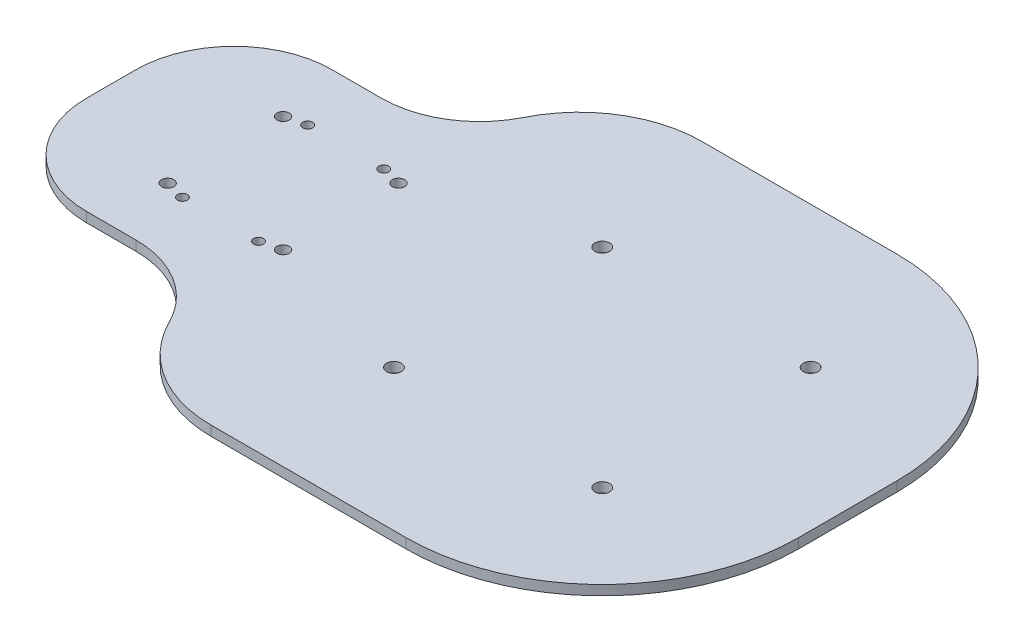
ISO-10303-21;
HEADER;
FILE_DESCRIPTION(('STEP AP214'),'2;1');
FILE_NAME('part.step','',(''),(''),'','','');
FILE_SCHEMA(('AUTOMOTIVE_DESIGN { 1 0 10303 214 1 1 1 1 }'));
ENDSEC;
DATA;
#1=APPLICATION_CONTEXT('core data for automotive mechanical design processes');
#2=APPLICATION_PROTOCOL_DEFINITION('international standard','automotive_design',2000,#1);
#3=PRODUCT_CONTEXT('',#1,'mechanical');
#4=PRODUCT('Part','Part','',(#3));
#5=PRODUCT_RELATED_PRODUCT_CATEGORY('part','',(#4));
#6=PRODUCT_DEFINITION_FORMATION('','',#4);
#7=PRODUCT_DEFINITION_CONTEXT('part definition',#1,'design');
#8=PRODUCT_DEFINITION('design','',#6,#7);
#9=PRODUCT_DEFINITION_SHAPE('','',#8);
#10=(LENGTH_UNIT() NAMED_UNIT(*) SI_UNIT(.MILLI.,.METRE.));
#11=(NAMED_UNIT(*) PLANE_ANGLE_UNIT() SI_UNIT($,.RADIAN.));
#12=(NAMED_UNIT(*) SI_UNIT($,.STERADIAN.) SOLID_ANGLE_UNIT());
#13=UNCERTAINTY_MEASURE_WITH_UNIT(LENGTH_MEASURE(1.E-05),#10,'distance_accuracy_value','');
#14=(GEOMETRIC_REPRESENTATION_CONTEXT(3) GLOBAL_UNCERTAINTY_ASSIGNED_CONTEXT((#13)) GLOBAL_UNIT_ASSIGNED_CONTEXT((#10,
#11,#12)) REPRESENTATION_CONTEXT('',''));
#15=CARTESIAN_POINT('',(0.,0.,0.));
#16=DIRECTION('',(0.,0.,1.));
#17=DIRECTION('',(1.,0.,0.));
#18=AXIS2_PLACEMENT_3D('',#15,#16,#17);
#19=CARTESIAN_POINT('',(100.,4.,-100.));
#20=DIRECTION('',(-1.,0.,0.));
#21=DIRECTION('',(0.,0.,1.));
#22=AXIS2_PLACEMENT_3D('',#19,#20,#21);
#23=PLANE('',#22);
#24=DIRECTION('',(0.,0.,-1.));
#25=VECTOR('',#24,1.);
#26=CARTESIAN_POINT('',(100.,0.,-100.));
#27=LINE('',#26,#25);
#28=CARTESIAN_POINT('',(100.,0.,20.));
#29=VERTEX_POINT('',#28);
#30=CARTESIAN_POINT('',(100.,0.,-20.));
#31=VERTEX_POINT('',#30);
#32=EDGE_CURVE('E167',#29,#31,#27,.T.);
#33=ORIENTED_EDGE('',*,*,#32,.T.);
#34=DIRECTION('',(0.,-1.,0.));
#35=VECTOR('',#34,1.);
#36=CARTESIAN_POINT('',(100.,4.,-20.));
#37=LINE('',#36,#35);
#38=CARTESIAN_POINT('',(100.,4.,-20.));
#39=VERTEX_POINT('',#38);
#40=EDGE_CURVE('E209',#31,#39,#37,.F.);
#41=ORIENTED_EDGE('',*,*,#40,.T.);
#42=DIRECTION('',(0.,0.,-1.));
#43=VECTOR('',#42,1.);
#44=CARTESIAN_POINT('',(100.,4.,-100.));
#45=LINE('',#44,#43);
#46=CARTESIAN_POINT('',(100.,4.,20.));
#47=VERTEX_POINT('',#46);
#48=EDGE_CURVE('E175',#47,#39,#45,.T.);
#49=ORIENTED_EDGE('',*,*,#48,.F.);
#50=DIRECTION('',(0.,-1.,0.));
#51=VECTOR('',#50,1.);
#52=CARTESIAN_POINT('',(100.,4.,20.));
#53=LINE('',#52,#51);
#54=EDGE_CURVE('E206',#47,#29,#53,.T.);
#55=ORIENTED_EDGE('',*,*,#54,.T.);
#56=EDGE_LOOP('',(#33,#41,#49,#55));
#57=FACE_BOUND('',#56,.T.);
#58=ADVANCED_FACE('F32',(#57),#23,.F.);
#59=CARTESIAN_POINT('',(-100.,4.,-100.));
#60=DIRECTION('',(0.,0.,1.));
#61=DIRECTION('',(1.,0.,0.));
#62=AXIS2_PLACEMENT_3D('',#59,#60,#61);
#63=PLANE('',#62);
#64=DIRECTION('',(-1.,0.,0.));
#65=VECTOR('',#64,1.);
#66=CARTESIAN_POINT('',(-100.,0.,-100.));
#67=LINE('',#66,#65);
#68=CARTESIAN_POINT('',(20.,0.,-100.));
#69=VERTEX_POINT('',#68);
#70=CARTESIAN_POINT('',(-59.3774225170145,0.,-100.));
#71=VERTEX_POINT('',#70);
#72=EDGE_CURVE('E161',#69,#71,#67,.T.);
#73=ORIENTED_EDGE('',*,*,#72,.T.);
#74=DIRECTION('',(0.,1.,0.));
#75=VECTOR('',#74,1.);
#76=CARTESIAN_POINT('',(-59.3774225170145,4.,-100.));
#77=LINE('',#76,#75);
#78=CARTESIAN_POINT('',(-59.3774225170145,4.,-100.));
#79=VERTEX_POINT('',#78);
#80=EDGE_CURVE('E223',#71,#79,#77,.T.);
#81=ORIENTED_EDGE('',*,*,#80,.T.);
#82=DIRECTION('',(-1.,0.,0.));
#83=VECTOR('',#82,1.);
#84=CARTESIAN_POINT('',(-100.,4.,-100.));
#85=LINE('',#84,#83);
#86=CARTESIAN_POINT('',(20.,4.,-100.));
#87=VERTEX_POINT('',#86);
#88=EDGE_CURVE('E247',#87,#79,#85,.T.);
#89=ORIENTED_EDGE('',*,*,#88,.F.);
#90=DIRECTION('',(0.,-1.,0.));
#91=VECTOR('',#90,1.);
#92=CARTESIAN_POINT('',(20.,4.,-100.));
#93=LINE('',#92,#91);
#94=EDGE_CURVE('E198',#87,#69,#93,.T.);
#95=ORIENTED_EDGE('',*,*,#94,.T.);
#96=EDGE_LOOP('',(#73,#81,#89,#95));
#97=FACE_BOUND('',#96,.T.);
#98=ADVANCED_FACE('F381',(#97),#63,.F.);
#99=CARTESIAN_POINT('',(-100.,4.,-50.));
#100=DIRECTION('',(0.,0.,1.));
#101=DIRECTION('',(1.,0.,0.));
#102=AXIS2_PLACEMENT_3D('',#99,#100,#101);
#103=PLANE('',#102);
#104=DIRECTION('',(-1.,0.,0.));
#105=VECTOR('',#104,1.);
#106=CARTESIAN_POINT('',(-100.,4.,-50.));
#107=LINE('',#106,#105);
#108=CARTESIAN_POINT('',(-140.,4.,-50.));
#109=VERTEX_POINT('',#108);
#110=CARTESIAN_POINT('',(-160.,4.,-50.));
#111=VERTEX_POINT('',#110);
#112=EDGE_CURVE('E153',#109,#111,#107,.T.);
#113=ORIENTED_EDGE('',*,*,#112,.F.);
#114=DIRECTION('',(0.,-1.,0.));
#115=VECTOR('',#114,1.);
#116=CARTESIAN_POINT('',(-140.,0.,-50.));
#117=LINE('',#116,#115);
#118=CARTESIAN_POINT('',(-140.,0.,-50.));
#119=VERTEX_POINT('',#118);
#120=EDGE_CURVE('E138',#109,#119,#117,.T.);
#121=ORIENTED_EDGE('',*,*,#120,.T.);
#122=DIRECTION('',(-1.,0.,0.));
#123=VECTOR('',#122,1.);
#124=CARTESIAN_POINT('',(-100.,0.,-50.));
#125=LINE('',#124,#123);
#126=CARTESIAN_POINT('',(-160.,0.,-50.));
#127=VERTEX_POINT('',#126);
#128=EDGE_CURVE('E150',#119,#127,#125,.T.);
#129=ORIENTED_EDGE('',*,*,#128,.T.);
#130=DIRECTION('',(0.,-1.,0.));
#131=VECTOR('',#130,1.);
#132=CARTESIAN_POINT('',(-160.,4.,-50.));
#133=LINE('',#132,#131);
#134=EDGE_CURVE('E155',#127,#111,#133,.F.);
#135=ORIENTED_EDGE('',*,*,#134,.T.);
#136=EDGE_LOOP('',(#113,#121,#129,#135));
#137=FACE_BOUND('',#136,.T.);
#138=ADVANCED_FACE('F149',(#137),#103,.F.);
#139=CARTESIAN_POINT('',(-200.,4.,50.));
#140=DIRECTION('',(1.,0.,0.));
#141=DIRECTION('',(0.,0.,-1.));
#142=AXIS2_PLACEMENT_3D('',#139,#140,#141);
#143=PLANE('',#142);
#144=DIRECTION('',(0.,0.,1.));
#145=VECTOR('',#144,1.);
#146=CARTESIAN_POINT('',(-200.,4.,50.));
#147=LINE('',#146,#145);
#148=CARTESIAN_POINT('',(-200.,4.,-9.99999999999999));
#149=VERTEX_POINT('',#148);
#150=CARTESIAN_POINT('',(-200.,4.,9.99999999999999));
#151=VERTEX_POINT('',#150);
#152=EDGE_CURVE('E255',#149,#151,#147,.T.);
#153=ORIENTED_EDGE('',*,*,#152,.F.);
#154=DIRECTION('',(0.,-1.,0.));
#155=VECTOR('',#154,1.);
#156=CARTESIAN_POINT('',(-200.,4.,-9.99999999999999));
#157=LINE('',#156,#155);
#158=CARTESIAN_POINT('',(-200.,0.,-9.99999999999999));
#159=VERTEX_POINT('',#158);
#160=EDGE_CURVE('E184',#149,#159,#157,.T.);
#161=ORIENTED_EDGE('',*,*,#160,.T.);
#162=DIRECTION('',(0.,0.,1.));
#163=VECTOR('',#162,1.);
#164=CARTESIAN_POINT('',(-200.,0.,50.));
#165=LINE('',#164,#163);
#166=CARTESIAN_POINT('',(-200.,0.,9.99999999999999));
#167=VERTEX_POINT('',#166);
#168=EDGE_CURVE('E160',#159,#167,#165,.T.);
#169=ORIENTED_EDGE('',*,*,#168,.T.);
#170=DIRECTION('',(0.,-1.,0.));
#171=VECTOR('',#170,1.);
#172=CARTESIAN_POINT('',(-200.,4.,9.99999999999999));
#173=LINE('',#172,#171);
#174=EDGE_CURVE('E182',#167,#151,#173,.F.);
#175=ORIENTED_EDGE('',*,*,#174,.T.);
#176=EDGE_LOOP('',(#153,#161,#169,#175));
#177=FACE_BOUND('',#176,.T.);
#178=ADVANCED_FACE('F419',(#177),#143,.F.);
#179=CARTESIAN_POINT('',(-100.,4.,50.));
#180=DIRECTION('',(0.,0.,-1.));
#181=DIRECTION('',(-1.,0.,0.));
#182=AXIS2_PLACEMENT_3D('',#179,#180,#181);
#183=PLANE('',#182);
#184=DIRECTION('',(1.,0.,0.));
#185=VECTOR('',#184,1.);
#186=CARTESIAN_POINT('',(-100.,0.,50.));
#187=LINE('',#186,#185);
#188=CARTESIAN_POINT('',(-160.,0.,50.));
#189=VERTEX_POINT('',#188);
#190=CARTESIAN_POINT('',(-140.,0.,50.));
#191=VERTEX_POINT('',#190);
#192=EDGE_CURVE('E164',#189,#191,#187,.T.);
#193=ORIENTED_EDGE('',*,*,#192,.T.);
#194=DIRECTION('',(0.,-1.,0.));
#195=VECTOR('',#194,1.);
#196=CARTESIAN_POINT('',(-140.,4.,50.));
#197=LINE('',#196,#195);
#198=CARTESIAN_POINT('',(-140.,4.,50.));
#199=VERTEX_POINT('',#198);
#200=EDGE_CURVE('E180',#191,#199,#197,.F.);
#201=ORIENTED_EDGE('',*,*,#200,.T.);
#202=DIRECTION('',(1.,0.,0.));
#203=VECTOR('',#202,1.);
#204=CARTESIAN_POINT('',(-100.,4.,50.));
#205=LINE('',#204,#203);
#206=CARTESIAN_POINT('',(-160.,4.,50.));
#207=VERTEX_POINT('',#206);
#208=EDGE_CURVE('E258',#207,#199,#205,.T.);
#209=ORIENTED_EDGE('',*,*,#208,.F.);
#210=DIRECTION('',(0.,-1.,0.));
#211=VECTOR('',#210,1.);
#212=CARTESIAN_POINT('',(-160.,4.,50.));
#213=LINE('',#212,#211);
#214=EDGE_CURVE('E154',#207,#189,#213,.T.);
#215=ORIENTED_EDGE('',*,*,#214,.T.);
#216=EDGE_LOOP('',(#193,#201,#209,#215));
#217=FACE_BOUND('',#216,.T.);
#218=ADVANCED_FACE('F426',(#217),#183,.F.);
#219=CARTESIAN_POINT('',(-100.,4.,100.));
#220=DIRECTION('',(0.,0.,-1.));
#221=DIRECTION('',(-1.,0.,0.));
#222=AXIS2_PLACEMENT_3D('',#219,#220,#221);
#223=PLANE('',#222);
#224=DIRECTION('',(1.,0.,0.));
#225=VECTOR('',#224,1.);
#226=CARTESIAN_POINT('',(-100.,4.,100.));
#227=LINE('',#226,#225);
#228=CARTESIAN_POINT('',(-59.3774225170145,4.,100.));
#229=VERTEX_POINT('',#228);
#230=CARTESIAN_POINT('',(20.,4.,100.));
#231=VERTEX_POINT('',#230);
#232=EDGE_CURVE('E176',#229,#231,#227,.T.);
#233=ORIENTED_EDGE('',*,*,#232,.F.);
#234=DIRECTION('',(0.,1.,0.));
#235=VECTOR('',#234,1.);
#236=CARTESIAN_POINT('',(-59.3774225170145,4.,100.));
#237=LINE('',#236,#235);
#238=CARTESIAN_POINT('',(-59.3774225170145,0.,100.));
#239=VERTEX_POINT('',#238);
#240=EDGE_CURVE('E40',#229,#239,#237,.F.);
#241=ORIENTED_EDGE('',*,*,#240,.T.);
#242=DIRECTION('',(1.,0.,0.));
#243=VECTOR('',#242,1.);
#244=CARTESIAN_POINT('',(-100.,0.,100.));
#245=LINE('',#244,#243);
#246=CARTESIAN_POINT('',(20.,0.,100.));
#247=VERTEX_POINT('',#246);
#248=EDGE_CURVE('E173',#239,#247,#245,.T.);
#249=ORIENTED_EDGE('',*,*,#248,.T.);
#250=DIRECTION('',(0.,-1.,0.));
#251=VECTOR('',#250,1.);
#252=CARTESIAN_POINT('',(20.,4.,100.));
#253=LINE('',#252,#251);
#254=EDGE_CURVE('E215',#247,#231,#253,.F.);
#255=ORIENTED_EDGE('',*,*,#254,.T.);
#256=EDGE_LOOP('',(#233,#241,#249,#255));
#257=FACE_BOUND('',#256,.T.);
#258=ADVANCED_FACE('F231',(#257),#223,.F.);
#259=CARTESIAN_POINT('',(0.,4.,0.));
#260=DIRECTION('',(0.,1.,0.));
#261=DIRECTION('',(0.,0.,1.));
#262=AXIS2_PLACEMENT_3D('',#259,#260,#261);
#263=PLANE('',#262);
#264=CARTESIAN_POINT('',(-114.5,4.,-25.5));
#265=DIRECTION('',(0.,1.,0.));
#266=DIRECTION('',(0.,0.,1.));
#267=AXIS2_PLACEMENT_3D('',#264,#265,#266);
#268=CIRCLE('',#267,2.);
#269=CARTESIAN_POINT('',(-114.5,4.,-23.5));
#270=VERTEX_POINT('',#269);
#271=EDGE_CURVE('E310',#270,#270,#268,.T.);
#272=ORIENTED_EDGE('',*,*,#271,.F.);
#273=EDGE_LOOP('',(#272));
#274=FACE_BOUND('',#273,.T.);
#275=CARTESIAN_POINT('',(-145.5,4.,-25.5));
#276=DIRECTION('',(0.,1.,0.));
#277=DIRECTION('',(0.,0.,1.));
#278=AXIS2_PLACEMENT_3D('',#275,#276,#277);
#279=CIRCLE('',#278,2.);
#280=CARTESIAN_POINT('',(-145.5,4.,-23.5));
#281=VERTEX_POINT('',#280);
#282=EDGE_CURVE('E316',#281,#281,#279,.T.);
#283=ORIENTED_EDGE('',*,*,#282,.F.);
#284=EDGE_LOOP('',(#283));
#285=FACE_BOUND('',#284,.T.);
#286=CARTESIAN_POINT('',(-145.5,4.,25.5));
#287=DIRECTION('',(0.,1.,0.));
#288=DIRECTION('',(0.,0.,1.));
#289=AXIS2_PLACEMENT_3D('',#286,#287,#288);
#290=CIRCLE('',#289,2.);
#291=CARTESIAN_POINT('',(-145.5,4.,27.5));
#292=VERTEX_POINT('',#291);
#293=EDGE_CURVE('E322',#292,#292,#290,.T.);
#294=ORIENTED_EDGE('',*,*,#293,.F.);
#295=EDGE_LOOP('',(#294));
#296=FACE_BOUND('',#295,.T.);
#297=CARTESIAN_POINT('',(-114.5,4.,25.5));
#298=DIRECTION('',(0.,1.,0.));
#299=DIRECTION('',(0.,0.,1.));
#300=AXIS2_PLACEMENT_3D('',#297,#298,#299);
#301=CIRCLE('',#300,2.);
#302=CARTESIAN_POINT('',(-114.5,4.,27.5));
#303=VERTEX_POINT('',#302);
#304=EDGE_CURVE('E328',#303,#303,#301,.T.);
#305=ORIENTED_EDGE('',*,*,#304,.F.);
#306=EDGE_LOOP('',(#305));
#307=FACE_BOUND('',#306,.T.);
#308=CARTESIAN_POINT('',(-106.5,4.,23.5));
#309=DIRECTION('',(0.,1.,0.));
#310=DIRECTION('',(0.,0.,1.));
#311=AXIS2_PLACEMENT_3D('',#308,#309,#310);
#312=CIRCLE('',#311,2.5);
#313=CARTESIAN_POINT('',(-106.5,4.,26.));
#314=VERTEX_POINT('',#313);
#315=EDGE_CURVE('E292',#314,#314,#312,.T.);
#316=ORIENTED_EDGE('',*,*,#315,.F.);
#317=EDGE_LOOP('',(#316));
#318=FACE_BOUND('',#317,.T.);
#319=CARTESIAN_POINT('',(-153.5,4.,23.5));
#320=DIRECTION('',(0.,1.,0.));
#321=DIRECTION('',(0.,0.,1.));
#322=AXIS2_PLACEMENT_3D('',#319,#320,#321);
#323=CIRCLE('',#322,2.5);
#324=CARTESIAN_POINT('',(-153.5,4.,26.));
#325=VERTEX_POINT('',#324);
#326=EDGE_CURVE('E299',#325,#325,#323,.T.);
#327=ORIENTED_EDGE('',*,*,#326,.F.);
#328=EDGE_LOOP('',(#327));
#329=FACE_BOUND('',#328,.T.);
#330=CARTESIAN_POINT('',(-153.5,4.,-23.5));
#331=DIRECTION('',(0.,1.,0.));
#332=DIRECTION('',(0.,0.,1.));
#333=AXIS2_PLACEMENT_3D('',#330,#331,#332);
#334=CIRCLE('',#333,2.5);
#335=CARTESIAN_POINT('',(-153.5,4.,-21.));
#336=VERTEX_POINT('',#335);
#337=EDGE_CURVE('E305',#336,#336,#334,.T.);
#338=ORIENTED_EDGE('',*,*,#337,.F.);
#339=EDGE_LOOP('',(#338));
#340=FACE_BOUND('',#339,.T.);
#341=CARTESIAN_POINT('',(-106.5,4.,-23.5));
#342=DIRECTION('',(0.,1.,0.));
#343=DIRECTION('',(0.,0.,1.));
#344=AXIS2_PLACEMENT_3D('',#341,#342,#343);
#345=CIRCLE('',#344,2.50000000000001);
#346=CARTESIAN_POINT('',(-106.5,4.,-21.));
#347=VERTEX_POINT('',#346);
#348=EDGE_CURVE('E286',#347,#347,#345,.T.);
#349=ORIENTED_EDGE('',*,*,#348,.F.);
#350=EDGE_LOOP('',(#349));
#351=FACE_BOUND('',#350,.T.);
#352=CARTESIAN_POINT('',(42.425,4.,42.425));
#353=DIRECTION('',(0.,1.,0.));
#354=DIRECTION('',(0.,0.,1.));
#355=AXIS2_PLACEMENT_3D('',#352,#353,#354);
#356=CIRCLE('',#355,3.);
#357=CARTESIAN_POINT('',(42.425,4.,45.425));
#358=VERTEX_POINT('',#357);
#359=EDGE_CURVE('E281',#358,#358,#356,.T.);
#360=ORIENTED_EDGE('',*,*,#359,.F.);
#361=EDGE_LOOP('',(#360));
#362=FACE_BOUND('',#361,.T.);
#363=CARTESIAN_POINT('',(-42.425,4.,42.425));
#364=DIRECTION('',(0.,1.,0.));
#365=DIRECTION('',(0.,0.,1.));
#366=AXIS2_PLACEMENT_3D('',#363,#364,#365);
#367=CIRCLE('',#366,3.);
#368=CARTESIAN_POINT('',(-42.425,4.,45.425));
#369=VERTEX_POINT('',#368);
#370=EDGE_CURVE('E275',#369,#369,#367,.T.);
#371=ORIENTED_EDGE('',*,*,#370,.F.);
#372=EDGE_LOOP('',(#371));
#373=FACE_BOUND('',#372,.T.);
#374=CARTESIAN_POINT('',(-42.425,4.,-42.425));
#375=DIRECTION('',(0.,1.,0.));
#376=DIRECTION('',(0.,0.,1.));
#377=AXIS2_PLACEMENT_3D('',#374,#375,#376);
#378=CIRCLE('',#377,2.99999999999999);
#379=CARTESIAN_POINT('',(-42.425,4.,-39.425));
#380=VERTEX_POINT('',#379);
#381=EDGE_CURVE('E268',#380,#380,#378,.T.);
#382=ORIENTED_EDGE('',*,*,#381,.F.);
#383=EDGE_LOOP('',(#382));
#384=FACE_BOUND('',#383,.T.);
#385=CARTESIAN_POINT('',(42.425,4.,-42.425));
#386=DIRECTION('',(0.,1.,0.));
#387=DIRECTION('',(0.,0.,1.));
#388=AXIS2_PLACEMENT_3D('',#385,#386,#387);
#389=CIRCLE('',#388,3.);
#390=CARTESIAN_POINT('',(42.425,4.,-39.425));
#391=VERTEX_POINT('',#390);
#392=EDGE_CURVE('E251',#391,#391,#389,.T.);
#393=ORIENTED_EDGE('',*,*,#392,.F.);
#394=EDGE_LOOP('',(#393));
#395=FACE_BOUND('',#394,.T.);
#396=ORIENTED_EDGE('',*,*,#88,.T.);
#397=CARTESIAN_POINT('',(-59.3774225170145,4.,-50.));
#398=DIRECTION('',(0.,1.,0.));
#399=DIRECTION('',(0.,0.,1.));
#400=AXIS2_PLACEMENT_3D('',#397,#398,#399);
#401=CIRCLE('',#400,50.);
#402=CARTESIAN_POINT('',(-104.167743340895,4.,-72.2222222222222));
#403=VERTEX_POINT('',#402);
#404=EDGE_CURVE('E226',#79,#403,#401,.T.);
#405=ORIENTED_EDGE('',*,*,#404,.T.);
#406=CARTESIAN_POINT('',(-140.,4.,-90.));
#407=DIRECTION('',(0.,1.,0.));
#408=DIRECTION('',(0.,0.,1.));
#409=AXIS2_PLACEMENT_3D('',#406,#407,#408);
#410=CIRCLE('',#409,40.);
#411=EDGE_CURVE('E143',#403,#109,#410,.F.);
#412=ORIENTED_EDGE('',*,*,#411,.T.);
#413=ORIENTED_EDGE('',*,*,#112,.T.);
#414=CARTESIAN_POINT('',(-160.,4.,-10.));
#415=DIRECTION('',(0.,1.,0.));
#416=DIRECTION('',(0.,0.,1.));
#417=AXIS2_PLACEMENT_3D('',#414,#415,#416);
#418=CIRCLE('',#417,40.);
#419=EDGE_CURVE('E144',#111,#149,#418,.T.);
#420=ORIENTED_EDGE('',*,*,#419,.T.);
#421=ORIENTED_EDGE('',*,*,#152,.T.);
#422=CARTESIAN_POINT('',(-160.,4.,9.99999999999999));
#423=DIRECTION('',(0.,1.,0.));
#424=DIRECTION('',(0.,0.,1.));
#425=AXIS2_PLACEMENT_3D('',#422,#423,#424);
#426=CIRCLE('',#425,40.);
#427=EDGE_CURVE('E190',#151,#207,#426,.T.);
#428=ORIENTED_EDGE('',*,*,#427,.T.);
#429=ORIENTED_EDGE('',*,*,#208,.T.);
#430=CARTESIAN_POINT('',(-140.,4.,90.));
#431=DIRECTION('',(0.,1.,0.));
#432=DIRECTION('',(0.,0.,1.));
#433=AXIS2_PLACEMENT_3D('',#430,#431,#432);
#434=CIRCLE('',#433,40.);
#435=CARTESIAN_POINT('',(-104.167743340895,4.,72.2222222222222));
#436=VERTEX_POINT('',#435);
#437=EDGE_CURVE('E196',#199,#436,#434,.F.);
#438=ORIENTED_EDGE('',*,*,#437,.T.);
#439=CARTESIAN_POINT('',(-59.3774225170145,4.,50.));
#440=DIRECTION('',(0.,1.,0.));
#441=DIRECTION('',(0.,0.,1.));
#442=AXIS2_PLACEMENT_3D('',#439,#440,#441);
#443=CIRCLE('',#442,50.);
#444=EDGE_CURVE('E47',#436,#229,#443,.T.);
#445=ORIENTED_EDGE('',*,*,#444,.T.);
#446=ORIENTED_EDGE('',*,*,#232,.T.);
#447=CARTESIAN_POINT('',(20.,4.,20.));
#448=DIRECTION('',(0.,1.,0.));
#449=DIRECTION('',(0.,0.,1.));
#450=AXIS2_PLACEMENT_3D('',#447,#448,#449);
#451=CIRCLE('',#450,80.);
#452=EDGE_CURVE('E211',#231,#47,#451,.T.);
#453=ORIENTED_EDGE('',*,*,#452,.T.);
#454=ORIENTED_EDGE('',*,*,#48,.T.);
#455=CARTESIAN_POINT('',(20.,4.,-20.));
#456=DIRECTION('',(0.,1.,0.));
#457=DIRECTION('',(0.,0.,1.));
#458=AXIS2_PLACEMENT_3D('',#455,#456,#457);
#459=CIRCLE('',#458,80.);
#460=EDGE_CURVE('E213',#39,#87,#459,.T.);
#461=ORIENTED_EDGE('',*,*,#460,.T.);
#462=EDGE_LOOP('',(#396,#405,#412,#413,#420,#421,#428,#429,#438,#445,#446,#453,#454,#461));
#463=FACE_BOUND('',#462,.T.);
#464=ADVANCED_FACE('F243',(#274,#285,#296,#307,#318,#329,#340,#351,#362,#373,#384,#395,#463),
#263,.T.);
#465=CARTESIAN_POINT('',(0.,0.,0.));
#466=DIRECTION('',(0.,1.,0.));
#467=DIRECTION('',(0.,0.,1.));
#468=AXIS2_PLACEMENT_3D('',#465,#466,#467);
#469=PLANE('',#468);
#470=CARTESIAN_POINT('',(-114.5,0.,-25.5));
#471=DIRECTION('',(0.,1.,0.));
#472=DIRECTION('',(0.,0.,1.));
#473=AXIS2_PLACEMENT_3D('',#470,#471,#472);
#474=CIRCLE('',#473,2.);
#475=CARTESIAN_POINT('',(-114.5,0.,-23.5));
#476=VERTEX_POINT('',#475);
#477=EDGE_CURVE('E313',#476,#476,#474,.T.);
#478=ORIENTED_EDGE('',*,*,#477,.T.);
#479=EDGE_LOOP('',(#478));
#480=FACE_BOUND('',#479,.T.);
#481=CARTESIAN_POINT('',(-145.5,0.,-25.5));
#482=DIRECTION('',(0.,1.,0.));
#483=DIRECTION('',(0.,0.,1.));
#484=AXIS2_PLACEMENT_3D('',#481,#482,#483);
#485=CIRCLE('',#484,2.);
#486=CARTESIAN_POINT('',(-145.5,0.,-23.5));
#487=VERTEX_POINT('',#486);
#488=EDGE_CURVE('E319',#487,#487,#485,.T.);
#489=ORIENTED_EDGE('',*,*,#488,.T.);
#490=EDGE_LOOP('',(#489));
#491=FACE_BOUND('',#490,.T.);
#492=CARTESIAN_POINT('',(-145.5,0.,25.5));
#493=DIRECTION('',(0.,1.,0.));
#494=DIRECTION('',(0.,0.,1.));
#495=AXIS2_PLACEMENT_3D('',#492,#493,#494);
#496=CIRCLE('',#495,2.);
#497=CARTESIAN_POINT('',(-145.5,0.,27.5));
#498=VERTEX_POINT('',#497);
#499=EDGE_CURVE('E325',#498,#498,#496,.T.);
#500=ORIENTED_EDGE('',*,*,#499,.T.);
#501=EDGE_LOOP('',(#500));
#502=FACE_BOUND('',#501,.T.);
#503=CARTESIAN_POINT('',(-114.5,0.,25.5));
#504=DIRECTION('',(0.,1.,0.));
#505=DIRECTION('',(0.,0.,1.));
#506=AXIS2_PLACEMENT_3D('',#503,#504,#505);
#507=CIRCLE('',#506,2.);
#508=CARTESIAN_POINT('',(-114.5,0.,27.5));
#509=VERTEX_POINT('',#508);
#510=EDGE_CURVE('E296',#509,#509,#507,.T.);
#511=ORIENTED_EDGE('',*,*,#510,.T.);
#512=EDGE_LOOP('',(#511));
#513=FACE_BOUND('',#512,.T.);
#514=CARTESIAN_POINT('',(-106.5,0.,23.5));
#515=DIRECTION('',(0.,1.,0.));
#516=DIRECTION('',(0.,0.,1.));
#517=AXIS2_PLACEMENT_3D('',#514,#515,#516);
#518=CIRCLE('',#517,2.5);
#519=CARTESIAN_POINT('',(-106.5,0.,26.));
#520=VERTEX_POINT('',#519);
#521=EDGE_CURVE('E295',#520,#520,#518,.T.);
#522=ORIENTED_EDGE('',*,*,#521,.T.);
#523=EDGE_LOOP('',(#522));
#524=FACE_BOUND('',#523,.T.);
#525=CARTESIAN_POINT('',(-153.5,0.,23.5));
#526=DIRECTION('',(0.,1.,0.));
#527=DIRECTION('',(0.,0.,1.));
#528=AXIS2_PLACEMENT_3D('',#525,#526,#527);
#529=CIRCLE('',#528,2.5);
#530=CARTESIAN_POINT('',(-153.5,0.,26.));
#531=VERTEX_POINT('',#530);
#532=EDGE_CURVE('E302',#531,#531,#529,.T.);
#533=ORIENTED_EDGE('',*,*,#532,.T.);
#534=EDGE_LOOP('',(#533));
#535=FACE_BOUND('',#534,.T.);
#536=CARTESIAN_POINT('',(-153.5,0.,-23.5));
#537=DIRECTION('',(0.,1.,0.));
#538=DIRECTION('',(0.,0.,1.));
#539=AXIS2_PLACEMENT_3D('',#536,#537,#538);
#540=CIRCLE('',#539,2.5);
#541=CARTESIAN_POINT('',(-153.5,0.,-21.));
#542=VERTEX_POINT('',#541);
#543=EDGE_CURVE('E289',#542,#542,#540,.T.);
#544=ORIENTED_EDGE('',*,*,#543,.T.);
#545=EDGE_LOOP('',(#544));
#546=FACE_BOUND('',#545,.T.);
#547=CARTESIAN_POINT('',(-106.5,0.,-23.5));
#548=DIRECTION('',(0.,1.,0.));
#549=DIRECTION('',(0.,0.,1.));
#550=AXIS2_PLACEMENT_3D('',#547,#548,#549);
#551=CIRCLE('',#550,2.50000000000001);
#552=CARTESIAN_POINT('',(-106.5,0.,-21.));
#553=VERTEX_POINT('',#552);
#554=EDGE_CURVE('E272',#553,#553,#551,.T.);
#555=ORIENTED_EDGE('',*,*,#554,.T.);
#556=EDGE_LOOP('',(#555));
#557=FACE_BOUND('',#556,.T.);
#558=CARTESIAN_POINT('',(42.425,0.,42.425));
#559=DIRECTION('',(0.,1.,0.));
#560=DIRECTION('',(0.,0.,1.));
#561=AXIS2_PLACEMENT_3D('',#558,#559,#560);
#562=CIRCLE('',#561,3.);
#563=CARTESIAN_POINT('',(42.425,0.,45.425));
#564=VERTEX_POINT('',#563);
#565=EDGE_CURVE('E266',#564,#564,#562,.T.);
#566=ORIENTED_EDGE('',*,*,#565,.T.);
#567=EDGE_LOOP('',(#566));
#568=FACE_BOUND('',#567,.T.);
#569=CARTESIAN_POINT('',(-42.425,0.,42.425));
#570=DIRECTION('',(0.,1.,0.));
#571=DIRECTION('',(0.,0.,1.));
#572=AXIS2_PLACEMENT_3D('',#569,#570,#571);
#573=CIRCLE('',#572,3.);
#574=CARTESIAN_POINT('',(-42.425,0.,45.425));
#575=VERTEX_POINT('',#574);
#576=EDGE_CURVE('E278',#575,#575,#573,.T.);
#577=ORIENTED_EDGE('',*,*,#576,.T.);
#578=EDGE_LOOP('',(#577));
#579=FACE_BOUND('',#578,.T.);
#580=CARTESIAN_POINT('',(-42.425,0.,-42.425));
#581=DIRECTION('',(0.,1.,0.));
#582=DIRECTION('',(0.,0.,1.));
#583=AXIS2_PLACEMENT_3D('',#580,#581,#582);
#584=CIRCLE('',#583,2.99999999999999);
#585=CARTESIAN_POINT('',(-42.425,0.,-39.425));
#586=VERTEX_POINT('',#585);
#587=EDGE_CURVE('E271',#586,#586,#584,.T.);
#588=ORIENTED_EDGE('',*,*,#587,.T.);
#589=EDGE_LOOP('',(#588));
#590=FACE_BOUND('',#589,.T.);
#591=CARTESIAN_POINT('',(42.425,0.,-42.425));
#592=DIRECTION('',(0.,1.,0.));
#593=DIRECTION('',(0.,0.,1.));
#594=AXIS2_PLACEMENT_3D('',#591,#592,#593);
#595=CIRCLE('',#594,3.);
#596=CARTESIAN_POINT('',(42.425,0.,-39.425));
#597=VERTEX_POINT('',#596);
#598=EDGE_CURVE('E261',#597,#597,#595,.T.);
#599=ORIENTED_EDGE('',*,*,#598,.T.);
#600=EDGE_LOOP('',(#599));
#601=FACE_BOUND('',#600,.T.);
#602=CARTESIAN_POINT('',(-140.,0.,-90.));
#603=DIRECTION('',(0.,1.,0.));
#604=DIRECTION('',(0.,0.,1.));
#605=AXIS2_PLACEMENT_3D('',#602,#603,#604);
#606=CIRCLE('',#605,40.);
#607=CARTESIAN_POINT('',(-104.167743340895,0.,-72.2222222222222));
#608=VERTEX_POINT('',#607);
#609=EDGE_CURVE('E134',#119,#608,#606,.T.);
#610=ORIENTED_EDGE('',*,*,#609,.T.);
#611=CARTESIAN_POINT('',(-59.3774225170145,0.,-50.));
#612=DIRECTION('',(0.,1.,0.));
#613=DIRECTION('',(0.,0.,1.));
#614=AXIS2_PLACEMENT_3D('',#611,#612,#613);
#615=CIRCLE('',#614,50.);
#616=EDGE_CURVE('E221',#608,#71,#615,.F.);
#617=ORIENTED_EDGE('',*,*,#616,.T.);
#618=ORIENTED_EDGE('',*,*,#72,.F.);
#619=CARTESIAN_POINT('',(20.,0.,-20.));
#620=DIRECTION('',(0.,1.,0.));
#621=DIRECTION('',(0.,0.,1.));
#622=AXIS2_PLACEMENT_3D('',#619,#620,#621);
#623=CIRCLE('',#622,80.);
#624=EDGE_CURVE('E204',#69,#31,#623,.F.);
#625=ORIENTED_EDGE('',*,*,#624,.T.);
#626=ORIENTED_EDGE('',*,*,#32,.F.);
#627=CARTESIAN_POINT('',(20.,0.,20.));
#628=DIRECTION('',(0.,1.,0.));
#629=DIRECTION('',(0.,0.,1.));
#630=AXIS2_PLACEMENT_3D('',#627,#628,#629);
#631=CIRCLE('',#630,80.);
#632=EDGE_CURVE('E201',#29,#247,#631,.F.);
#633=ORIENTED_EDGE('',*,*,#632,.T.);
#634=ORIENTED_EDGE('',*,*,#248,.F.);
#635=CARTESIAN_POINT('',(-59.3774225170145,0.,50.));
#636=DIRECTION('',(0.,1.,0.));
#637=DIRECTION('',(0.,0.,1.));
#638=AXIS2_PLACEMENT_3D('',#635,#636,#637);
#639=CIRCLE('',#638,50.);
#640=CARTESIAN_POINT('',(-104.167743340895,0.,72.2222222222222));
#641=VERTEX_POINT('',#640);
#642=EDGE_CURVE('E219',#239,#641,#639,.F.);
#643=ORIENTED_EDGE('',*,*,#642,.T.);
#644=CARTESIAN_POINT('',(-140.,0.,90.));
#645=DIRECTION('',(0.,1.,0.));
#646=DIRECTION('',(0.,0.,1.));
#647=AXIS2_PLACEMENT_3D('',#644,#645,#646);
#648=CIRCLE('',#647,40.);
#649=EDGE_CURVE('E194',#641,#191,#648,.T.);
#650=ORIENTED_EDGE('',*,*,#649,.T.);
#651=ORIENTED_EDGE('',*,*,#192,.F.);
#652=CARTESIAN_POINT('',(-160.,0.,9.99999999999999));
#653=DIRECTION('',(0.,1.,0.));
#654=DIRECTION('',(0.,0.,1.));
#655=AXIS2_PLACEMENT_3D('',#652,#653,#654);
#656=CIRCLE('',#655,40.);
#657=EDGE_CURVE('E187',#189,#167,#656,.F.);
#658=ORIENTED_EDGE('',*,*,#657,.T.);
#659=ORIENTED_EDGE('',*,*,#168,.F.);
#660=CARTESIAN_POINT('',(-160.,0.,-10.));
#661=DIRECTION('',(0.,1.,0.));
#662=DIRECTION('',(0.,0.,1.));
#663=AXIS2_PLACEMENT_3D('',#660,#661,#662);
#664=CIRCLE('',#663,40.);
#665=EDGE_CURVE('E159',#159,#127,#664,.F.);
#666=ORIENTED_EDGE('',*,*,#665,.T.);
#667=ORIENTED_EDGE('',*,*,#128,.F.);
#668=EDGE_LOOP('',(#610,#617,#618,#625,#626,#633,#634,#643,#650,#651,#658,#659,#666,#667));
#669=FACE_BOUND('',#668,.T.);
#670=ADVANCED_FACE('F157',(#480,#491,#502,#513,#524,#535,#546,#557,#568,#579,#590,#601,#669),
#469,.F.);
#671=CARTESIAN_POINT('',(-140.,4.,-90.));
#672=DIRECTION('',(0.,1.,0.));
#673=DIRECTION('',(0.,0.,1.));
#674=AXIS2_PLACEMENT_3D('',#671,#672,#673);
#675=CYLINDRICAL_SURFACE('',#674,40.);
#676=ORIENTED_EDGE('',*,*,#411,.F.);
#677=DIRECTION('',(0.,1.,0.));
#678=VECTOR('',#677,1.);
#679=CARTESIAN_POINT('',(-104.167743340895,4.,-72.2222222222222));
#680=LINE('',#679,#678);
#681=EDGE_CURVE('E140',#403,#608,#680,.F.);
#682=ORIENTED_EDGE('',*,*,#681,.T.);
#683=ORIENTED_EDGE('',*,*,#609,.F.);
#684=ORIENTED_EDGE('',*,*,#120,.F.);
#685=EDGE_LOOP('',(#676,#682,#683,#684));
#686=FACE_BOUND('',#685,.T.);
#687=ADVANCED_FACE('F137',(#686),#675,.F.);
#688=CARTESIAN_POINT('',(-140.,4.,90.));
#689=DIRECTION('',(0.,1.,0.));
#690=DIRECTION('',(0.,0.,1.));
#691=AXIS2_PLACEMENT_3D('',#688,#689,#690);
#692=CYLINDRICAL_SURFACE('',#691,40.);
#693=ORIENTED_EDGE('',*,*,#649,.F.);
#694=DIRECTION('',(0.,1.,0.));
#695=VECTOR('',#694,1.);
#696=CARTESIAN_POINT('',(-104.167743340895,4.,72.2222222222222));
#697=LINE('',#696,#695);
#698=EDGE_CURVE('E11',#641,#436,#697,.T.);
#699=ORIENTED_EDGE('',*,*,#698,.T.);
#700=ORIENTED_EDGE('',*,*,#437,.F.);
#701=ORIENTED_EDGE('',*,*,#200,.F.);
#702=EDGE_LOOP('',(#693,#699,#700,#701));
#703=FACE_BOUND('',#702,.T.);
#704=ADVANCED_FACE('F392',(#703),#692,.F.);
#705=CARTESIAN_POINT('',(-160.,4.,-10.));
#706=DIRECTION('',(0.,-1.,0.));
#707=DIRECTION('',(0.,0.,-1.));
#708=AXIS2_PLACEMENT_3D('',#705,#706,#707);
#709=CYLINDRICAL_SURFACE('',#708,40.);
#710=ORIENTED_EDGE('',*,*,#419,.F.);
#711=ORIENTED_EDGE('',*,*,#134,.F.);
#712=ORIENTED_EDGE('',*,*,#665,.F.);
#713=ORIENTED_EDGE('',*,*,#160,.F.);
#714=EDGE_LOOP('',(#710,#711,#712,#713));
#715=FACE_BOUND('',#714,.T.);
#716=ADVANCED_FACE('F377',(#715),#709,.T.);
#717=CARTESIAN_POINT('',(-160.,4.,9.99999999999999));
#718=DIRECTION('',(0.,-1.,0.));
#719=DIRECTION('',(0.,0.,-1.));
#720=AXIS2_PLACEMENT_3D('',#717,#718,#719);
#721=CYLINDRICAL_SURFACE('',#720,40.);
#722=ORIENTED_EDGE('',*,*,#427,.F.);
#723=ORIENTED_EDGE('',*,*,#174,.F.);
#724=ORIENTED_EDGE('',*,*,#657,.F.);
#725=ORIENTED_EDGE('',*,*,#214,.F.);
#726=EDGE_LOOP('',(#722,#723,#724,#725));
#727=FACE_BOUND('',#726,.T.);
#728=ADVANCED_FACE('F367',(#727),#721,.T.);
#729=CARTESIAN_POINT('',(42.425,0.,-42.425));
#730=DIRECTION('',(0.,1.,0.));
#731=DIRECTION('',(0.,0.,1.));
#732=AXIS2_PLACEMENT_3D('',#729,#730,#731);
#733=CYLINDRICAL_SURFACE('',#732,3.);
#734=ORIENTED_EDGE('',*,*,#598,.F.);
#735=EDGE_LOOP('',(#734));
#736=FACE_BOUND('',#735,.T.);
#737=ORIENTED_EDGE('',*,*,#392,.T.);
#738=EDGE_LOOP('',(#737));
#739=FACE_BOUND('',#738,.T.);
#740=ADVANCED_FACE('F364',(#736,#739),#733,.F.);
#741=CARTESIAN_POINT('',(-42.425,0.,-42.425));
#742=DIRECTION('',(0.,1.,0.));
#743=DIRECTION('',(0.,0.,1.));
#744=AXIS2_PLACEMENT_3D('',#741,#742,#743);
#745=CYLINDRICAL_SURFACE('',#744,2.99999999999999);
#746=ORIENTED_EDGE('',*,*,#587,.F.);
#747=EDGE_LOOP('',(#746));
#748=FACE_BOUND('',#747,.T.);
#749=ORIENTED_EDGE('',*,*,#381,.T.);
#750=EDGE_LOOP('',(#749));
#751=FACE_BOUND('',#750,.T.);
#752=ADVANCED_FACE('F366',(#748,#751),#745,.F.);
#753=CARTESIAN_POINT('',(-42.425,0.,42.425));
#754=DIRECTION('',(0.,1.,0.));
#755=DIRECTION('',(0.,0.,1.));
#756=AXIS2_PLACEMENT_3D('',#753,#754,#755);
#757=CYLINDRICAL_SURFACE('',#756,3.);
#758=ORIENTED_EDGE('',*,*,#576,.F.);
#759=EDGE_LOOP('',(#758));
#760=FACE_BOUND('',#759,.T.);
#761=ORIENTED_EDGE('',*,*,#370,.T.);
#762=EDGE_LOOP('',(#761));
#763=FACE_BOUND('',#762,.T.);
#764=ADVANCED_FACE('F374',(#760,#763),#757,.F.);
#765=CARTESIAN_POINT('',(42.425,0.,42.425));
#766=DIRECTION('',(0.,1.,0.));
#767=DIRECTION('',(0.,0.,1.));
#768=AXIS2_PLACEMENT_3D('',#765,#766,#767);
#769=CYLINDRICAL_SURFACE('',#768,3.);
#770=ORIENTED_EDGE('',*,*,#565,.F.);
#771=EDGE_LOOP('',(#770));
#772=FACE_BOUND('',#771,.T.);
#773=ORIENTED_EDGE('',*,*,#359,.T.);
#774=EDGE_LOOP('',(#773));
#775=FACE_BOUND('',#774,.T.);
#776=ADVANCED_FACE('F483',(#772,#775),#769,.F.);
#777=CARTESIAN_POINT('',(-106.5,0.,-23.5));
#778=DIRECTION('',(0.,1.,0.));
#779=DIRECTION('',(0.,0.,1.));
#780=AXIS2_PLACEMENT_3D('',#777,#778,#779);
#781=CYLINDRICAL_SURFACE('',#780,2.50000000000001);
#782=ORIENTED_EDGE('',*,*,#554,.F.);
#783=EDGE_LOOP('',(#782));
#784=FACE_BOUND('',#783,.T.);
#785=ORIENTED_EDGE('',*,*,#348,.T.);
#786=EDGE_LOOP('',(#785));
#787=FACE_BOUND('',#786,.T.);
#788=ADVANCED_FACE('F493',(#784,#787),#781,.F.);
#789=CARTESIAN_POINT('',(-153.5,0.,-23.5));
#790=DIRECTION('',(0.,1.,0.));
#791=DIRECTION('',(0.,0.,1.));
#792=AXIS2_PLACEMENT_3D('',#789,#790,#791);
#793=CYLINDRICAL_SURFACE('',#792,2.5);
#794=ORIENTED_EDGE('',*,*,#543,.F.);
#795=EDGE_LOOP('',(#794));
#796=FACE_BOUND('',#795,.T.);
#797=ORIENTED_EDGE('',*,*,#337,.T.);
#798=EDGE_LOOP('',(#797));
#799=FACE_BOUND('',#798,.T.);
#800=ADVANCED_FACE('F503',(#796,#799),#793,.F.);
#801=CARTESIAN_POINT('',(-153.5,0.,23.5));
#802=DIRECTION('',(0.,1.,0.));
#803=DIRECTION('',(0.,0.,1.));
#804=AXIS2_PLACEMENT_3D('',#801,#802,#803);
#805=CYLINDRICAL_SURFACE('',#804,2.5);
#806=ORIENTED_EDGE('',*,*,#532,.F.);
#807=EDGE_LOOP('',(#806));
#808=FACE_BOUND('',#807,.T.);
#809=ORIENTED_EDGE('',*,*,#326,.T.);
#810=EDGE_LOOP('',(#809));
#811=FACE_BOUND('',#810,.T.);
#812=ADVANCED_FACE('F513',(#808,#811),#805,.F.);
#813=CARTESIAN_POINT('',(-106.5,0.,23.5));
#814=DIRECTION('',(0.,1.,0.));
#815=DIRECTION('',(0.,0.,1.));
#816=AXIS2_PLACEMENT_3D('',#813,#814,#815);
#817=CYLINDRICAL_SURFACE('',#816,2.5);
#818=ORIENTED_EDGE('',*,*,#521,.F.);
#819=EDGE_LOOP('',(#818));
#820=FACE_BOUND('',#819,.T.);
#821=ORIENTED_EDGE('',*,*,#315,.T.);
#822=EDGE_LOOP('',(#821));
#823=FACE_BOUND('',#822,.T.);
#824=ADVANCED_FACE('F340',(#820,#823),#817,.F.);
#825=CARTESIAN_POINT('',(-114.5,0.,25.5));
#826=DIRECTION('',(0.,1.,0.));
#827=DIRECTION('',(0.,0.,1.));
#828=AXIS2_PLACEMENT_3D('',#825,#826,#827);
#829=CYLINDRICAL_SURFACE('',#828,2.);
#830=ORIENTED_EDGE('',*,*,#510,.F.);
#831=EDGE_LOOP('',(#830));
#832=FACE_BOUND('',#831,.T.);
#833=ORIENTED_EDGE('',*,*,#304,.T.);
#834=EDGE_LOOP('',(#833));
#835=FACE_BOUND('',#834,.T.);
#836=ADVANCED_FACE('F336',(#832,#835),#829,.F.);
#837=CARTESIAN_POINT('',(-145.5,0.,25.5));
#838=DIRECTION('',(0.,1.,0.));
#839=DIRECTION('',(0.,0.,1.));
#840=AXIS2_PLACEMENT_3D('',#837,#838,#839);
#841=CYLINDRICAL_SURFACE('',#840,2.);
#842=ORIENTED_EDGE('',*,*,#499,.F.);
#843=EDGE_LOOP('',(#842));
#844=FACE_BOUND('',#843,.T.);
#845=ORIENTED_EDGE('',*,*,#293,.T.);
#846=EDGE_LOOP('',(#845));
#847=FACE_BOUND('',#846,.T.);
#848=ADVANCED_FACE('F339',(#844,#847),#841,.F.);
#849=CARTESIAN_POINT('',(-145.5,0.,-25.5));
#850=DIRECTION('',(0.,1.,0.));
#851=DIRECTION('',(0.,0.,1.));
#852=AXIS2_PLACEMENT_3D('',#849,#850,#851);
#853=CYLINDRICAL_SURFACE('',#852,2.);
#854=ORIENTED_EDGE('',*,*,#488,.F.);
#855=EDGE_LOOP('',(#854));
#856=FACE_BOUND('',#855,.T.);
#857=ORIENTED_EDGE('',*,*,#282,.T.);
#858=EDGE_LOOP('',(#857));
#859=FACE_BOUND('',#858,.T.);
#860=ADVANCED_FACE('F547',(#856,#859),#853,.F.);
#861=CARTESIAN_POINT('',(-114.5,0.,-25.5));
#862=DIRECTION('',(0.,1.,0.));
#863=DIRECTION('',(0.,0.,1.));
#864=AXIS2_PLACEMENT_3D('',#861,#862,#863);
#865=CYLINDRICAL_SURFACE('',#864,2.);
#866=ORIENTED_EDGE('',*,*,#477,.F.);
#867=EDGE_LOOP('',(#866));
#868=FACE_BOUND('',#867,.T.);
#869=ORIENTED_EDGE('',*,*,#271,.T.);
#870=EDGE_LOOP('',(#869));
#871=FACE_BOUND('',#870,.T.);
#872=ADVANCED_FACE('F401',(#868,#871),#865,.F.);
#873=CARTESIAN_POINT('',(20.,4.,-20.));
#874=DIRECTION('',(0.,-1.,0.));
#875=DIRECTION('',(0.,0.,-1.));
#876=AXIS2_PLACEMENT_3D('',#873,#874,#875);
#877=CYLINDRICAL_SURFACE('',#876,80.);
#878=ORIENTED_EDGE('',*,*,#460,.F.);
#879=ORIENTED_EDGE('',*,*,#40,.F.);
#880=ORIENTED_EDGE('',*,*,#624,.F.);
#881=ORIENTED_EDGE('',*,*,#94,.F.);
#882=EDGE_LOOP('',(#878,#879,#880,#881));
#883=FACE_BOUND('',#882,.T.);
#884=ADVANCED_FACE('F398',(#883),#877,.T.);
#885=CARTESIAN_POINT('',(20.,4.,20.));
#886=DIRECTION('',(0.,-1.,0.));
#887=DIRECTION('',(0.,0.,-1.));
#888=AXIS2_PLACEMENT_3D('',#885,#886,#887);
#889=CYLINDRICAL_SURFACE('',#888,80.);
#890=ORIENTED_EDGE('',*,*,#452,.F.);
#891=ORIENTED_EDGE('',*,*,#254,.F.);
#892=ORIENTED_EDGE('',*,*,#632,.F.);
#893=ORIENTED_EDGE('',*,*,#54,.F.);
#894=EDGE_LOOP('',(#890,#891,#892,#893));
#895=FACE_BOUND('',#894,.T.);
#896=ADVANCED_FACE('F239',(#895),#889,.T.);
#897=CARTESIAN_POINT('',(-59.3774225170145,4.,-50.));
#898=DIRECTION('',(0.,1.,0.));
#899=DIRECTION('',(0.,0.,1.));
#900=AXIS2_PLACEMENT_3D('',#897,#898,#899);
#901=CYLINDRICAL_SURFACE('',#900,50.);
#902=ORIENTED_EDGE('',*,*,#404,.F.);
#903=ORIENTED_EDGE('',*,*,#80,.F.);
#904=ORIENTED_EDGE('',*,*,#616,.F.);
#905=ORIENTED_EDGE('',*,*,#681,.F.);
#906=EDGE_LOOP('',(#902,#903,#904,#905));
#907=FACE_BOUND('',#906,.T.);
#908=ADVANCED_FACE('F404',(#907),#901,.T.);
#909=CARTESIAN_POINT('',(-59.3774225170145,4.,50.));
#910=DIRECTION('',(0.,1.,0.));
#911=DIRECTION('',(0.,0.,1.));
#912=AXIS2_PLACEMENT_3D('',#909,#910,#911);
#913=CYLINDRICAL_SURFACE('',#912,50.);
#914=ORIENTED_EDGE('',*,*,#444,.F.);
#915=ORIENTED_EDGE('',*,*,#698,.F.);
#916=ORIENTED_EDGE('',*,*,#642,.F.);
#917=ORIENTED_EDGE('',*,*,#240,.F.);
#918=EDGE_LOOP('',(#914,#915,#916,#917));
#919=FACE_BOUND('',#918,.T.);
#920=ADVANCED_FACE('F34',(#919),#913,.T.);
#921=CLOSED_SHELL('',(#58,#98,#138,#178,#218,#258,#464,#670,#687,#704,#716,#728,#740,#752,#764,
#776,#788,#800,#812,#824,#836,#848,#860,#872,#884,#896,#908,#920));
#922=MANIFOLD_SOLID_BREP('B2',#921);
#923=ADVANCED_BREP_SHAPE_REPRESENTATION('',(#18,#922),#14);
#924=SHAPE_DEFINITION_REPRESENTATION(#9,#923);
ENDSEC;
END-ISO-10303-21;
